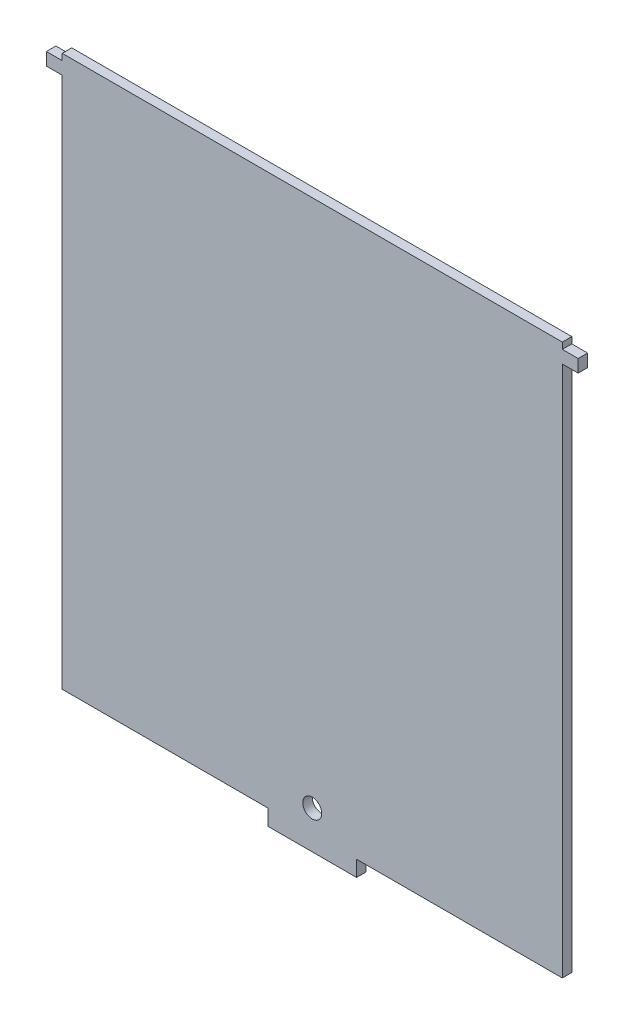
ISO-10303-21;
HEADER;
FILE_DESCRIPTION(('STEP AP214'),'2;1');
FILE_NAME('part.step','',(''),(''),'','','');
FILE_SCHEMA(('AUTOMOTIVE_DESIGN { 1 0 10303 214 1 1 1 1 }'));
ENDSEC;
DATA;
#1=APPLICATION_CONTEXT('core data for automotive mechanical design processes');
#2=APPLICATION_PROTOCOL_DEFINITION('international standard','automotive_design',2000,#1);
#3=PRODUCT_CONTEXT('',#1,'mechanical');
#4=PRODUCT('Part','Part','',(#3));
#5=PRODUCT_RELATED_PRODUCT_CATEGORY('part','',(#4));
#6=PRODUCT_DEFINITION_FORMATION('','',#4);
#7=PRODUCT_DEFINITION_CONTEXT('part definition',#1,'design');
#8=PRODUCT_DEFINITION('design','',#6,#7);
#9=PRODUCT_DEFINITION_SHAPE('','',#8);
#10=(LENGTH_UNIT() NAMED_UNIT(*) SI_UNIT(.MILLI.,.METRE.));
#11=(NAMED_UNIT(*) PLANE_ANGLE_UNIT() SI_UNIT($,.RADIAN.));
#12=(NAMED_UNIT(*) SI_UNIT($,.STERADIAN.) SOLID_ANGLE_UNIT());
#13=UNCERTAINTY_MEASURE_WITH_UNIT(LENGTH_MEASURE(1.E-05),#10,'distance_accuracy_value','');
#14=(GEOMETRIC_REPRESENTATION_CONTEXT(3) GLOBAL_UNCERTAINTY_ASSIGNED_CONTEXT((#13)) GLOBAL_UNIT_ASSIGNED_CONTEXT((#10,
#11,#12)) REPRESENTATION_CONTEXT('',''));
#15=CARTESIAN_POINT('',(0.,0.,0.));
#16=DIRECTION('',(0.,0.,1.));
#17=DIRECTION('',(1.,0.,0.));
#18=AXIS2_PLACEMENT_3D('',#15,#16,#17);
#19=CARTESIAN_POINT('',(0.,0.,3.));
#20=DIRECTION('',(0.,0.,-1.));
#21=DIRECTION('',(-1.,0.,0.));
#22=AXIS2_PLACEMENT_3D('',#19,#20,#21);
#23=PLANE('',#22);
#24=DIRECTION('',(0.,-1.,0.));
#25=VECTOR('',#24,1.);
#26=CARTESIAN_POINT('',(-82.564895235089,99.6794258373206,3.));
#27=LINE('',#26,#25);
#28=CARTESIAN_POINT('',(-82.564895235089,101.679425837321,3.));
#29=VERTEX_POINT('',#28);
#30=CARTESIAN_POINT('',(-82.564895235089,99.6794258373206,3.));
#31=VERTEX_POINT('',#30);
#32=EDGE_CURVE('E215',#29,#31,#27,.T.);
#33=ORIENTED_EDGE('',*,*,#32,.T.);
#34=DIRECTION('',(-1.,0.,0.));
#35=VECTOR('',#34,1.);
#36=CARTESIAN_POINT('',(-82.564895235089,99.6794258373206,3.));
#37=LINE('',#36,#35);
#38=CARTESIAN_POINT('',(-87.564895235089,99.6794258373206,3.));
#39=VERTEX_POINT('',#38);
#40=EDGE_CURVE('E123',#31,#39,#37,.T.);
#41=ORIENTED_EDGE('',*,*,#40,.T.);
#42=DIRECTION('',(0.,-1.,0.));
#43=VECTOR('',#42,1.);
#44=CARTESIAN_POINT('',(-87.564895235089,99.6794258373206,3.));
#45=LINE('',#44,#43);
#46=CARTESIAN_POINT('',(-87.564895235089,95.6794258373206,3.));
#47=VERTEX_POINT('',#46);
#48=EDGE_CURVE('E254',#39,#47,#45,.T.);
#49=ORIENTED_EDGE('',*,*,#48,.T.);
#50=DIRECTION('',(1.,0.,0.));
#51=VECTOR('',#50,1.);
#52=CARTESIAN_POINT('',(-82.564895235089,95.6794258373206,3.));
#53=LINE('',#52,#51);
#54=CARTESIAN_POINT('',(-82.564895235089,95.6794258373206,3.));
#55=VERTEX_POINT('',#54);
#56=EDGE_CURVE('E273',#47,#55,#53,.T.);
#57=ORIENTED_EDGE('',*,*,#56,.T.);
#58=DIRECTION('',(0.,-1.,0.));
#59=VECTOR('',#58,1.);
#60=CARTESIAN_POINT('',(-82.564895235089,95.6794258373206,3.));
#61=LINE('',#60,#59);
#62=CARTESIAN_POINT('',(-82.564895235089,-72.3205741626794,3.));
#63=VERTEX_POINT('',#62);
#64=EDGE_CURVE('E270',#55,#63,#61,.T.);
#65=ORIENTED_EDGE('',*,*,#64,.T.);
#66=DIRECTION('',(1.,0.,0.));
#67=VECTOR('',#66,1.);
#68=CARTESIAN_POINT('',(-82.564895235089,-72.3205741626794,3.));
#69=LINE('',#68,#67);
#70=CARTESIAN_POINT('',(-17.564895235089,-72.3205741626794,3.));
#71=VERTEX_POINT('',#70);
#72=EDGE_CURVE('E272',#63,#71,#69,.T.);
#73=ORIENTED_EDGE('',*,*,#72,.T.);
#74=DIRECTION('',(0.,-1.,0.));
#75=VECTOR('',#74,1.);
#76=CARTESIAN_POINT('',(-17.564895235089,-72.3205741626794,3.));
#77=LINE('',#76,#75);
#78=CARTESIAN_POINT('',(-17.564895235089,-77.3205741626794,3.));
#79=VERTEX_POINT('',#78);
#80=EDGE_CURVE('E275',#71,#79,#77,.T.);
#81=ORIENTED_EDGE('',*,*,#80,.T.);
#82=DIRECTION('',(1.,0.,0.));
#83=VECTOR('',#82,1.);
#84=CARTESIAN_POINT('',(-17.564895235089,-77.3205741626794,3.));
#85=LINE('',#84,#83);
#86=CARTESIAN_POINT('',(10.435104764911,-77.3205741626794,3.));
#87=VERTEX_POINT('',#86);
#88=EDGE_CURVE('E281',#79,#87,#85,.T.);
#89=ORIENTED_EDGE('',*,*,#88,.T.);
#90=DIRECTION('',(0.,1.,0.));
#91=VECTOR('',#90,1.);
#92=CARTESIAN_POINT('',(10.435104764911,-72.3205741626794,3.));
#93=LINE('',#92,#91);
#94=CARTESIAN_POINT('',(10.435104764911,-72.3205741626794,3.));
#95=VERTEX_POINT('',#94);
#96=EDGE_CURVE('E283',#87,#95,#93,.T.);
#97=ORIENTED_EDGE('',*,*,#96,.T.);
#98=DIRECTION('',(1.,0.,0.));
#99=VECTOR('',#98,1.);
#100=CARTESIAN_POINT('',(10.435104764911,-72.3205741626794,3.));
#101=LINE('',#100,#99);
#102=CARTESIAN_POINT('',(75.435104764911,-72.3205741626794,3.));
#103=VERTEX_POINT('',#102);
#104=EDGE_CURVE('E285',#95,#103,#101,.T.);
#105=ORIENTED_EDGE('',*,*,#104,.T.);
#106=DIRECTION('',(0.,1.,0.));
#107=VECTOR('',#106,1.);
#108=CARTESIAN_POINT('',(75.435104764911,95.6794258373206,3.));
#109=LINE('',#108,#107);
#110=CARTESIAN_POINT('',(75.435104764911,95.6794258373206,3.));
#111=VERTEX_POINT('',#110);
#112=EDGE_CURVE('E287',#103,#111,#109,.T.);
#113=ORIENTED_EDGE('',*,*,#112,.T.);
#114=DIRECTION('',(1.,0.,0.));
#115=VECTOR('',#114,1.);
#116=CARTESIAN_POINT('',(75.435104764911,95.6794258373206,3.));
#117=LINE('',#116,#115);
#118=CARTESIAN_POINT('',(80.435104764911,95.6794258373206,3.));
#119=VERTEX_POINT('',#118);
#120=EDGE_CURVE('E289',#111,#119,#117,.T.);
#121=ORIENTED_EDGE('',*,*,#120,.T.);
#122=DIRECTION('',(0.,1.,0.));
#123=VECTOR('',#122,1.);
#124=CARTESIAN_POINT('',(80.435104764911,99.6794258373206,3.));
#125=LINE('',#124,#123);
#126=CARTESIAN_POINT('',(80.435104764911,99.6794258373206,3.));
#127=VERTEX_POINT('',#126);
#128=EDGE_CURVE('E166',#119,#127,#125,.T.);
#129=ORIENTED_EDGE('',*,*,#128,.T.);
#130=DIRECTION('',(-1.,0.,0.));
#131=VECTOR('',#130,1.);
#132=CARTESIAN_POINT('',(75.435104764911,99.6794258373206,3.));
#133=LINE('',#132,#131);
#134=CARTESIAN_POINT('',(75.435104764911,99.6794258373206,3.));
#135=VERTEX_POINT('',#134);
#136=EDGE_CURVE('E160',#127,#135,#133,.T.);
#137=ORIENTED_EDGE('',*,*,#136,.T.);
#138=DIRECTION('',(0.,1.,0.));
#139=VECTOR('',#138,1.);
#140=CARTESIAN_POINT('',(75.435104764911,99.6794258373206,3.));
#141=LINE('',#140,#139);
#142=CARTESIAN_POINT('',(75.435104764911,101.679425837321,3.));
#143=VERTEX_POINT('',#142);
#144=EDGE_CURVE('E164',#135,#143,#141,.T.);
#145=ORIENTED_EDGE('',*,*,#144,.T.);
#146=DIRECTION('',(-1.,0.,0.));
#147=VECTOR('',#146,1.);
#148=CARTESIAN_POINT('',(-82.564895235089,101.679425837321,3.));
#149=LINE('',#148,#147);
#150=EDGE_CURVE('E56',#143,#29,#149,.T.);
#151=ORIENTED_EDGE('',*,*,#150,.T.);
#152=EDGE_LOOP('',(#33,#41,#49,#57,#65,#73,#81,#89,#97,#105,#113,#121,#129,#137,#145,#151));
#153=FACE_BOUND('',#152,.T.);
#154=CARTESIAN_POINT('',(-3.56489523508897,-65.3205741626794,3.));
#155=DIRECTION('',(0.,0.,1.));
#156=DIRECTION('',(1.,0.,0.));
#157=AXIS2_PLACEMENT_3D('',#154,#155,#156);
#158=CIRCLE('',#157,3.);
#159=CARTESIAN_POINT('',(-0.564895235088971,-65.3205741626794,3.));
#160=VERTEX_POINT('',#159);
#161=EDGE_CURVE('E188',#160,#160,#158,.T.);
#162=ORIENTED_EDGE('',*,*,#161,.F.);
#163=EDGE_LOOP('',(#162));
#164=FACE_BOUND('',#163,.T.);
#165=ADVANCED_FACE('F39',(#153,#164),#23,.F.);
#166=CARTESIAN_POINT('',(0.,0.,0.));
#167=DIRECTION('',(0.,0.,-1.));
#168=DIRECTION('',(-1.,0.,0.));
#169=AXIS2_PLACEMENT_3D('',#166,#167,#168);
#170=PLANE('',#169);
#171=DIRECTION('',(0.,-1.,0.));
#172=VECTOR('',#171,1.);
#173=CARTESIAN_POINT('',(-82.564895235089,99.6794258373206,0.));
#174=LINE('',#173,#172);
#175=CARTESIAN_POINT('',(-82.564895235089,101.679425837321,0.));
#176=VERTEX_POINT('',#175);
#177=CARTESIAN_POINT('',(-82.564895235089,99.6794258373206,0.));
#178=VERTEX_POINT('',#177);
#179=EDGE_CURVE('E184',#176,#178,#174,.T.);
#180=ORIENTED_EDGE('',*,*,#179,.F.);
#181=DIRECTION('',(-1.,0.,0.));
#182=VECTOR('',#181,1.);
#183=CARTESIAN_POINT('',(-82.564895235089,101.679425837321,0.));
#184=LINE('',#183,#182);
#185=CARTESIAN_POINT('',(75.435104764911,101.679425837321,0.));
#186=VERTEX_POINT('',#185);
#187=EDGE_CURVE('E115',#186,#176,#184,.T.);
#188=ORIENTED_EDGE('',*,*,#187,.F.);
#189=DIRECTION('',(0.,1.,0.));
#190=VECTOR('',#189,1.);
#191=CARTESIAN_POINT('',(75.435104764911,99.6794258373206,0.));
#192=LINE('',#191,#190);
#193=CARTESIAN_POINT('',(75.435104764911,99.6794258373206,0.));
#194=VERTEX_POINT('',#193);
#195=EDGE_CURVE('E109',#194,#186,#192,.T.);
#196=ORIENTED_EDGE('',*,*,#195,.F.);
#197=DIRECTION('',(-1.,0.,0.));
#198=VECTOR('',#197,1.);
#199=CARTESIAN_POINT('',(75.435104764911,99.6794258373206,0.));
#200=LINE('',#199,#198);
#201=CARTESIAN_POINT('',(80.435104764911,99.6794258373206,0.));
#202=VERTEX_POINT('',#201);
#203=EDGE_CURVE('E174',#202,#194,#200,.T.);
#204=ORIENTED_EDGE('',*,*,#203,.F.);
#205=DIRECTION('',(0.,1.,0.));
#206=VECTOR('',#205,1.);
#207=CARTESIAN_POINT('',(80.435104764911,99.6794258373206,0.));
#208=LINE('',#207,#206);
#209=CARTESIAN_POINT('',(80.435104764911,95.6794258373206,0.));
#210=VERTEX_POINT('',#209);
#211=EDGE_CURVE('E210',#210,#202,#208,.T.);
#212=ORIENTED_EDGE('',*,*,#211,.F.);
#213=DIRECTION('',(1.,0.,0.));
#214=VECTOR('',#213,1.);
#215=CARTESIAN_POINT('',(75.435104764911,95.6794258373206,0.));
#216=LINE('',#215,#214);
#217=CARTESIAN_POINT('',(75.435104764911,95.6794258373206,0.));
#218=VERTEX_POINT('',#217);
#219=EDGE_CURVE('E208',#218,#210,#216,.T.);
#220=ORIENTED_EDGE('',*,*,#219,.F.);
#221=DIRECTION('',(0.,1.,0.));
#222=VECTOR('',#221,1.);
#223=CARTESIAN_POINT('',(75.435104764911,95.6794258373206,0.));
#224=LINE('',#223,#222);
#225=CARTESIAN_POINT('',(75.435104764911,-72.3205741626794,0.));
#226=VERTEX_POINT('',#225);
#227=EDGE_CURVE('E206',#226,#218,#224,.T.);
#228=ORIENTED_EDGE('',*,*,#227,.F.);
#229=DIRECTION('',(1.,0.,0.));
#230=VECTOR('',#229,1.);
#231=CARTESIAN_POINT('',(10.435104764911,-72.3205741626794,0.));
#232=LINE('',#231,#230);
#233=CARTESIAN_POINT('',(10.435104764911,-72.3205741626794,0.));
#234=VERTEX_POINT('',#233);
#235=EDGE_CURVE('E204',#234,#226,#232,.T.);
#236=ORIENTED_EDGE('',*,*,#235,.F.);
#237=DIRECTION('',(0.,1.,0.));
#238=VECTOR('',#237,1.);
#239=CARTESIAN_POINT('',(10.435104764911,-72.3205741626794,0.));
#240=LINE('',#239,#238);
#241=CARTESIAN_POINT('',(10.435104764911,-77.3205741626794,0.));
#242=VERTEX_POINT('',#241);
#243=EDGE_CURVE('E202',#242,#234,#240,.T.);
#244=ORIENTED_EDGE('',*,*,#243,.F.);
#245=DIRECTION('',(1.,0.,0.));
#246=VECTOR('',#245,1.);
#247=CARTESIAN_POINT('',(-17.564895235089,-77.3205741626794,0.));
#248=LINE('',#247,#246);
#249=CARTESIAN_POINT('',(-17.564895235089,-77.3205741626794,0.));
#250=VERTEX_POINT('',#249);
#251=EDGE_CURVE('E200',#250,#242,#248,.T.);
#252=ORIENTED_EDGE('',*,*,#251,.F.);
#253=DIRECTION('',(0.,-1.,0.));
#254=VECTOR('',#253,1.);
#255=CARTESIAN_POINT('',(-17.564895235089,-72.3205741626794,0.));
#256=LINE('',#255,#254);
#257=CARTESIAN_POINT('',(-17.564895235089,-72.3205741626794,0.));
#258=VERTEX_POINT('',#257);
#259=EDGE_CURVE('E198',#258,#250,#256,.T.);
#260=ORIENTED_EDGE('',*,*,#259,.F.);
#261=DIRECTION('',(1.,0.,0.));
#262=VECTOR('',#261,1.);
#263=CARTESIAN_POINT('',(-82.564895235089,-72.3205741626794,0.));
#264=LINE('',#263,#262);
#265=CARTESIAN_POINT('',(-82.564895235089,-72.3205741626794,0.));
#266=VERTEX_POINT('',#265);
#267=EDGE_CURVE('E196',#266,#258,#264,.T.);
#268=ORIENTED_EDGE('',*,*,#267,.F.);
#269=DIRECTION('',(0.,-1.,0.));
#270=VECTOR('',#269,1.);
#271=CARTESIAN_POINT('',(-82.564895235089,95.6794258373206,0.));
#272=LINE('',#271,#270);
#273=CARTESIAN_POINT('',(-82.564895235089,95.6794258373206,0.));
#274=VERTEX_POINT('',#273);
#275=EDGE_CURVE('E194',#274,#266,#272,.T.);
#276=ORIENTED_EDGE('',*,*,#275,.F.);
#277=DIRECTION('',(1.,0.,0.));
#278=VECTOR('',#277,1.);
#279=CARTESIAN_POINT('',(-82.564895235089,95.6794258373206,0.));
#280=LINE('',#279,#278);
#281=CARTESIAN_POINT('',(-87.564895235089,95.6794258373206,0.));
#282=VERTEX_POINT('',#281);
#283=EDGE_CURVE('E192',#282,#274,#280,.T.);
#284=ORIENTED_EDGE('',*,*,#283,.F.);
#285=DIRECTION('',(0.,-1.,0.));
#286=VECTOR('',#285,1.);
#287=CARTESIAN_POINT('',(-87.564895235089,99.6794258373206,0.));
#288=LINE('',#287,#286);
#289=CARTESIAN_POINT('',(-87.564895235089,99.6794258373206,0.));
#290=VERTEX_POINT('',#289);
#291=EDGE_CURVE('E190',#290,#282,#288,.T.);
#292=ORIENTED_EDGE('',*,*,#291,.F.);
#293=DIRECTION('',(-1.,0.,0.));
#294=VECTOR('',#293,1.);
#295=CARTESIAN_POINT('',(-82.564895235089,99.6794258373206,0.));
#296=LINE('',#295,#294);
#297=EDGE_CURVE('E187',#178,#290,#296,.T.);
#298=ORIENTED_EDGE('',*,*,#297,.F.);
#299=EDGE_LOOP('',(#180,#188,#196,#204,#212,#220,#228,#236,#244,#252,#260,#268,#276,#284,#292,#298));
#300=FACE_BOUND('',#299,.T.);
#301=CARTESIAN_POINT('',(-3.56489523508897,-65.3205741626794,0.));
#302=DIRECTION('',(0.,0.,1.));
#303=DIRECTION('',(1.,0.,0.));
#304=AXIS2_PLACEMENT_3D('',#301,#302,#303);
#305=CIRCLE('',#304,3.);
#306=CARTESIAN_POINT('',(-0.564895235088971,-65.3205741626794,0.));
#307=VERTEX_POINT('',#306);
#308=EDGE_CURVE('E545',#307,#307,#305,.T.);
#309=ORIENTED_EDGE('',*,*,#308,.T.);
#310=EDGE_LOOP('',(#309));
#311=FACE_BOUND('',#310,.T.);
#312=ADVANCED_FACE('F258',(#300,#311),#170,.T.);
#313=CARTESIAN_POINT('',(-82.564895235089,99.6794258373206,3.));
#314=DIRECTION('',(1.,0.,0.));
#315=DIRECTION('',(0.,0.,-1.));
#316=AXIS2_PLACEMENT_3D('',#313,#314,#315);
#317=PLANE('',#316);
#318=ORIENTED_EDGE('',*,*,#179,.T.);
#319=DIRECTION('',(0.,0.,-1.));
#320=VECTOR('',#319,1.);
#321=CARTESIAN_POINT('',(-82.564895235089,99.6794258373206,3.));
#322=LINE('',#321,#320);
#323=EDGE_CURVE('E11',#31,#178,#322,.T.);
#324=ORIENTED_EDGE('',*,*,#323,.F.);
#325=ORIENTED_EDGE('',*,*,#32,.F.);
#326=DIRECTION('',(0.,0.,-1.));
#327=VECTOR('',#326,1.);
#328=CARTESIAN_POINT('',(-82.564895235089,101.679425837321,3.));
#329=LINE('',#328,#327);
#330=EDGE_CURVE('E180',#29,#176,#329,.T.);
#331=ORIENTED_EDGE('',*,*,#330,.T.);
#332=EDGE_LOOP('',(#318,#324,#325,#331));
#333=FACE_BOUND('',#332,.T.);
#334=ADVANCED_FACE('F41',(#333),#317,.F.);
#335=CARTESIAN_POINT('',(-82.564895235089,99.6794258373206,3.));
#336=DIRECTION('',(0.,-1.,0.));
#337=DIRECTION('',(0.,0.,-1.));
#338=AXIS2_PLACEMENT_3D('',#335,#336,#337);
#339=PLANE('',#338);
#340=ORIENTED_EDGE('',*,*,#297,.T.);
#341=DIRECTION('',(0.,0.,-1.));
#342=VECTOR('',#341,1.);
#343=CARTESIAN_POINT('',(-87.564895235089,99.6794258373206,3.));
#344=LINE('',#343,#342);
#345=EDGE_CURVE('E48',#39,#290,#344,.T.);
#346=ORIENTED_EDGE('',*,*,#345,.F.);
#347=ORIENTED_EDGE('',*,*,#40,.F.);
#348=ORIENTED_EDGE('',*,*,#323,.T.);
#349=EDGE_LOOP('',(#340,#346,#347,#348));
#350=FACE_BOUND('',#349,.T.);
#351=ADVANCED_FACE('F323',(#350),#339,.F.);
#352=CARTESIAN_POINT('',(-87.564895235089,99.6794258373206,3.));
#353=DIRECTION('',(1.,0.,0.));
#354=DIRECTION('',(0.,0.,-1.));
#355=AXIS2_PLACEMENT_3D('',#352,#353,#354);
#356=PLANE('',#355);
#357=ORIENTED_EDGE('',*,*,#291,.T.);
#358=DIRECTION('',(0.,0.,-1.));
#359=VECTOR('',#358,1.);
#360=CARTESIAN_POINT('',(-87.564895235089,95.6794258373206,3.));
#361=LINE('',#360,#359);
#362=EDGE_CURVE('E246',#47,#282,#361,.T.);
#363=ORIENTED_EDGE('',*,*,#362,.F.);
#364=ORIENTED_EDGE('',*,*,#48,.F.);
#365=ORIENTED_EDGE('',*,*,#345,.T.);
#366=EDGE_LOOP('',(#357,#363,#364,#365));
#367=FACE_BOUND('',#366,.T.);
#368=ADVANCED_FACE('F252',(#367),#356,.F.);
#369=CARTESIAN_POINT('',(-82.564895235089,95.6794258373206,3.));
#370=DIRECTION('',(0.,1.,0.));
#371=DIRECTION('',(0.,0.,1.));
#372=AXIS2_PLACEMENT_3D('',#369,#370,#371);
#373=PLANE('',#372);
#374=ORIENTED_EDGE('',*,*,#283,.T.);
#375=DIRECTION('',(0.,0.,-1.));
#376=VECTOR('',#375,1.);
#377=CARTESIAN_POINT('',(-82.564895235089,95.6794258373206,3.));
#378=LINE('',#377,#376);
#379=EDGE_CURVE('E243',#55,#274,#378,.T.);
#380=ORIENTED_EDGE('',*,*,#379,.F.);
#381=ORIENTED_EDGE('',*,*,#56,.F.);
#382=ORIENTED_EDGE('',*,*,#362,.T.);
#383=EDGE_LOOP('',(#374,#380,#381,#382));
#384=FACE_BOUND('',#383,.T.);
#385=ADVANCED_FACE('F264',(#384),#373,.F.);
#386=CARTESIAN_POINT('',(-82.564895235089,95.6794258373206,3.));
#387=DIRECTION('',(1.,0.,0.));
#388=DIRECTION('',(0.,1.,0.));
#389=AXIS2_PLACEMENT_3D('',#386,#387,#388);
#390=PLANE('',#389);
#391=ORIENTED_EDGE('',*,*,#275,.T.);
#392=DIRECTION('',(0.,0.,-1.));
#393=VECTOR('',#392,1.);
#394=CARTESIAN_POINT('',(-82.564895235089,-72.3205741626794,3.));
#395=LINE('',#394,#393);
#396=EDGE_CURVE('E240',#63,#266,#395,.T.);
#397=ORIENTED_EDGE('',*,*,#396,.F.);
#398=ORIENTED_EDGE('',*,*,#64,.F.);
#399=ORIENTED_EDGE('',*,*,#379,.T.);
#400=EDGE_LOOP('',(#391,#397,#398,#399));
#401=FACE_BOUND('',#400,.T.);
#402=ADVANCED_FACE('F268',(#401),#390,.F.);
#403=CARTESIAN_POINT('',(-82.564895235089,-72.3205741626794,3.));
#404=DIRECTION('',(0.,1.,0.));
#405=DIRECTION('',(0.,0.,1.));
#406=AXIS2_PLACEMENT_3D('',#403,#404,#405);
#407=PLANE('',#406);
#408=ORIENTED_EDGE('',*,*,#267,.T.);
#409=DIRECTION('',(0.,0.,-1.));
#410=VECTOR('',#409,1.);
#411=CARTESIAN_POINT('',(-17.564895235089,-72.3205741626794,3.));
#412=LINE('',#411,#410);
#413=EDGE_CURVE('E237',#71,#258,#412,.T.);
#414=ORIENTED_EDGE('',*,*,#413,.F.);
#415=ORIENTED_EDGE('',*,*,#72,.F.);
#416=ORIENTED_EDGE('',*,*,#396,.T.);
#417=EDGE_LOOP('',(#408,#414,#415,#416));
#418=FACE_BOUND('',#417,.T.);
#419=ADVANCED_FACE('F336',(#418),#407,.F.);
#420=CARTESIAN_POINT('',(-17.564895235089,-72.3205741626794,3.));
#421=DIRECTION('',(1.,0.,0.));
#422=DIRECTION('',(0.,0.,-1.));
#423=AXIS2_PLACEMENT_3D('',#420,#421,#422);
#424=PLANE('',#423);
#425=ORIENTED_EDGE('',*,*,#259,.T.);
#426=DIRECTION('',(0.,0.,-1.));
#427=VECTOR('',#426,1.);
#428=CARTESIAN_POINT('',(-17.564895235089,-77.3205741626794,3.));
#429=LINE('',#428,#427);
#430=EDGE_CURVE('E234',#79,#250,#429,.T.);
#431=ORIENTED_EDGE('',*,*,#430,.F.);
#432=ORIENTED_EDGE('',*,*,#80,.F.);
#433=ORIENTED_EDGE('',*,*,#413,.T.);
#434=EDGE_LOOP('',(#425,#431,#432,#433));
#435=FACE_BOUND('',#434,.T.);
#436=ADVANCED_FACE('F339',(#435),#424,.F.);
#437=CARTESIAN_POINT('',(-17.564895235089,-77.3205741626794,3.));
#438=DIRECTION('',(0.,1.,0.));
#439=DIRECTION('',(0.,0.,1.));
#440=AXIS2_PLACEMENT_3D('',#437,#438,#439);
#441=PLANE('',#440);
#442=ORIENTED_EDGE('',*,*,#251,.T.);
#443=DIRECTION('',(0.,0.,-1.));
#444=VECTOR('',#443,1.);
#445=CARTESIAN_POINT('',(10.435104764911,-77.3205741626794,3.));
#446=LINE('',#445,#444);
#447=EDGE_CURVE('E231',#87,#242,#446,.T.);
#448=ORIENTED_EDGE('',*,*,#447,.F.);
#449=ORIENTED_EDGE('',*,*,#88,.F.);
#450=ORIENTED_EDGE('',*,*,#430,.T.);
#451=EDGE_LOOP('',(#442,#448,#449,#450));
#452=FACE_BOUND('',#451,.T.);
#453=ADVANCED_FACE('F343',(#452),#441,.F.);
#454=CARTESIAN_POINT('',(10.435104764911,-72.3205741626794,3.));
#455=DIRECTION('',(-1.,0.,0.));
#456=DIRECTION('',(0.,0.,1.));
#457=AXIS2_PLACEMENT_3D('',#454,#455,#456);
#458=PLANE('',#457);
#459=ORIENTED_EDGE('',*,*,#243,.T.);
#460=DIRECTION('',(0.,0.,-1.));
#461=VECTOR('',#460,1.);
#462=CARTESIAN_POINT('',(10.435104764911,-72.3205741626794,3.));
#463=LINE('',#462,#461);
#464=EDGE_CURVE('E228',#95,#234,#463,.T.);
#465=ORIENTED_EDGE('',*,*,#464,.F.);
#466=ORIENTED_EDGE('',*,*,#96,.F.);
#467=ORIENTED_EDGE('',*,*,#447,.T.);
#468=EDGE_LOOP('',(#459,#465,#466,#467));
#469=FACE_BOUND('',#468,.T.);
#470=ADVANCED_FACE('F347',(#469),#458,.F.);
#471=CARTESIAN_POINT('',(10.435104764911,-72.3205741626794,3.));
#472=DIRECTION('',(0.,1.,0.));
#473=DIRECTION('',(0.,0.,1.));
#474=AXIS2_PLACEMENT_3D('',#471,#472,#473);
#475=PLANE('',#474);
#476=ORIENTED_EDGE('',*,*,#235,.T.);
#477=DIRECTION('',(0.,0.,-1.));
#478=VECTOR('',#477,1.);
#479=CARTESIAN_POINT('',(75.435104764911,-72.3205741626794,3.));
#480=LINE('',#479,#478);
#481=EDGE_CURVE('E225',#103,#226,#480,.T.);
#482=ORIENTED_EDGE('',*,*,#481,.F.);
#483=ORIENTED_EDGE('',*,*,#104,.F.);
#484=ORIENTED_EDGE('',*,*,#464,.T.);
#485=EDGE_LOOP('',(#476,#482,#483,#484));
#486=FACE_BOUND('',#485,.T.);
#487=ADVANCED_FACE('F351',(#486),#475,.F.);
#488=CARTESIAN_POINT('',(75.435104764911,95.6794258373206,3.));
#489=DIRECTION('',(-1.,0.,0.));
#490=DIRECTION('',(0.,-1.,0.));
#491=AXIS2_PLACEMENT_3D('',#488,#489,#490);
#492=PLANE('',#491);
#493=ORIENTED_EDGE('',*,*,#227,.T.);
#494=DIRECTION('',(0.,0.,-1.));
#495=VECTOR('',#494,1.);
#496=CARTESIAN_POINT('',(75.435104764911,95.6794258373206,3.));
#497=LINE('',#496,#495);
#498=EDGE_CURVE('E222',#111,#218,#497,.T.);
#499=ORIENTED_EDGE('',*,*,#498,.F.);
#500=ORIENTED_EDGE('',*,*,#112,.F.);
#501=ORIENTED_EDGE('',*,*,#481,.T.);
#502=EDGE_LOOP('',(#493,#499,#500,#501));
#503=FACE_BOUND('',#502,.T.);
#504=ADVANCED_FACE('F355',(#503),#492,.F.);
#505=CARTESIAN_POINT('',(75.435104764911,95.6794258373206,3.));
#506=DIRECTION('',(0.,1.,0.));
#507=DIRECTION('',(0.,0.,1.));
#508=AXIS2_PLACEMENT_3D('',#505,#506,#507);
#509=PLANE('',#508);
#510=ORIENTED_EDGE('',*,*,#219,.T.);
#511=DIRECTION('',(0.,0.,-1.));
#512=VECTOR('',#511,1.);
#513=CARTESIAN_POINT('',(80.435104764911,95.6794258373206,3.));
#514=LINE('',#513,#512);
#515=EDGE_CURVE('E219',#119,#210,#514,.T.);
#516=ORIENTED_EDGE('',*,*,#515,.F.);
#517=ORIENTED_EDGE('',*,*,#120,.F.);
#518=ORIENTED_EDGE('',*,*,#498,.T.);
#519=EDGE_LOOP('',(#510,#516,#517,#518));
#520=FACE_BOUND('',#519,.T.);
#521=ADVANCED_FACE('F295',(#520),#509,.F.);
#522=CARTESIAN_POINT('',(80.435104764911,99.6794258373206,3.));
#523=DIRECTION('',(-1.,0.,0.));
#524=DIRECTION('',(0.,0.,1.));
#525=AXIS2_PLACEMENT_3D('',#522,#523,#524);
#526=PLANE('',#525);
#527=ORIENTED_EDGE('',*,*,#211,.T.);
#528=DIRECTION('',(0.,0.,-1.));
#529=VECTOR('',#528,1.);
#530=CARTESIAN_POINT('',(80.435104764911,99.6794258373206,3.));
#531=LINE('',#530,#529);
#532=EDGE_CURVE('E175',#127,#202,#531,.T.);
#533=ORIENTED_EDGE('',*,*,#532,.F.);
#534=ORIENTED_EDGE('',*,*,#128,.F.);
#535=ORIENTED_EDGE('',*,*,#515,.T.);
#536=EDGE_LOOP('',(#527,#533,#534,#535));
#537=FACE_BOUND('',#536,.T.);
#538=ADVANCED_FACE('F299',(#537),#526,.F.);
#539=CARTESIAN_POINT('',(75.435104764911,99.6794258373206,3.));
#540=DIRECTION('',(0.,-1.,0.));
#541=DIRECTION('',(0.,0.,-1.));
#542=AXIS2_PLACEMENT_3D('',#539,#540,#541);
#543=PLANE('',#542);
#544=ORIENTED_EDGE('',*,*,#203,.T.);
#545=DIRECTION('',(0.,0.,-1.));
#546=VECTOR('',#545,1.);
#547=CARTESIAN_POINT('',(75.435104764911,99.6794258373206,3.));
#548=LINE('',#547,#546);
#549=EDGE_CURVE('E171',#135,#194,#548,.T.);
#550=ORIENTED_EDGE('',*,*,#549,.F.);
#551=ORIENTED_EDGE('',*,*,#136,.F.);
#552=ORIENTED_EDGE('',*,*,#532,.T.);
#553=EDGE_LOOP('',(#544,#550,#551,#552));
#554=FACE_BOUND('',#553,.T.);
#555=ADVANCED_FACE('F172',(#554),#543,.F.);
#556=CARTESIAN_POINT('',(75.435104764911,99.6794258373206,3.));
#557=DIRECTION('',(-1.,0.,0.));
#558=DIRECTION('',(0.,0.,1.));
#559=AXIS2_PLACEMENT_3D('',#556,#557,#558);
#560=PLANE('',#559);
#561=ORIENTED_EDGE('',*,*,#195,.T.);
#562=DIRECTION('',(0.,0.,-1.));
#563=VECTOR('',#562,1.);
#564=CARTESIAN_POINT('',(75.435104764911,101.679425837321,3.));
#565=LINE('',#564,#563);
#566=EDGE_CURVE('E176',#143,#186,#565,.T.);
#567=ORIENTED_EDGE('',*,*,#566,.F.);
#568=ORIENTED_EDGE('',*,*,#144,.F.);
#569=ORIENTED_EDGE('',*,*,#549,.T.);
#570=EDGE_LOOP('',(#561,#567,#568,#569));
#571=FACE_BOUND('',#570,.T.);
#572=ADVANCED_FACE('F178',(#571),#560,.F.);
#573=CARTESIAN_POINT('',(-82.564895235089,101.679425837321,3.));
#574=DIRECTION('',(0.,-1.,0.));
#575=DIRECTION('',(0.,0.,-1.));
#576=AXIS2_PLACEMENT_3D('',#573,#574,#575);
#577=PLANE('',#576);
#578=ORIENTED_EDGE('',*,*,#187,.T.);
#579=ORIENTED_EDGE('',*,*,#330,.F.);
#580=ORIENTED_EDGE('',*,*,#150,.F.);
#581=ORIENTED_EDGE('',*,*,#566,.T.);
#582=EDGE_LOOP('',(#578,#579,#580,#581));
#583=FACE_BOUND('',#582,.T.);
#584=ADVANCED_FACE('F303',(#583),#577,.F.);
#585=CARTESIAN_POINT('',(-3.56489523508897,-65.3205741626794,3.));
#586=DIRECTION('',(0.,0.,-1.));
#587=DIRECTION('',(-1.,0.,0.));
#588=AXIS2_PLACEMENT_3D('',#585,#586,#587);
#589=CYLINDRICAL_SURFACE('',#588,3.);
#590=ORIENTED_EDGE('',*,*,#161,.T.);
#591=EDGE_LOOP('',(#590));
#592=FACE_BOUND('',#591,.T.);
#593=ORIENTED_EDGE('',*,*,#308,.F.);
#594=EDGE_LOOP('',(#593));
#595=FACE_BOUND('',#594,.T.);
#596=ADVANCED_FACE('F305',(#592,#595),#589,.F.);
#597=CLOSED_SHELL('',(#165,#312,#334,#351,#368,#385,#402,#419,#436,#453,#470,#487,#504,#521,
#538,#555,#572,#584,#596));
#598=MANIFOLD_SOLID_BREP('B2',#597);
#599=ADVANCED_BREP_SHAPE_REPRESENTATION('',(#18,#598),#14);
#600=SHAPE_DEFINITION_REPRESENTATION(#9,#599);
ENDSEC;
END-ISO-10303-21;
